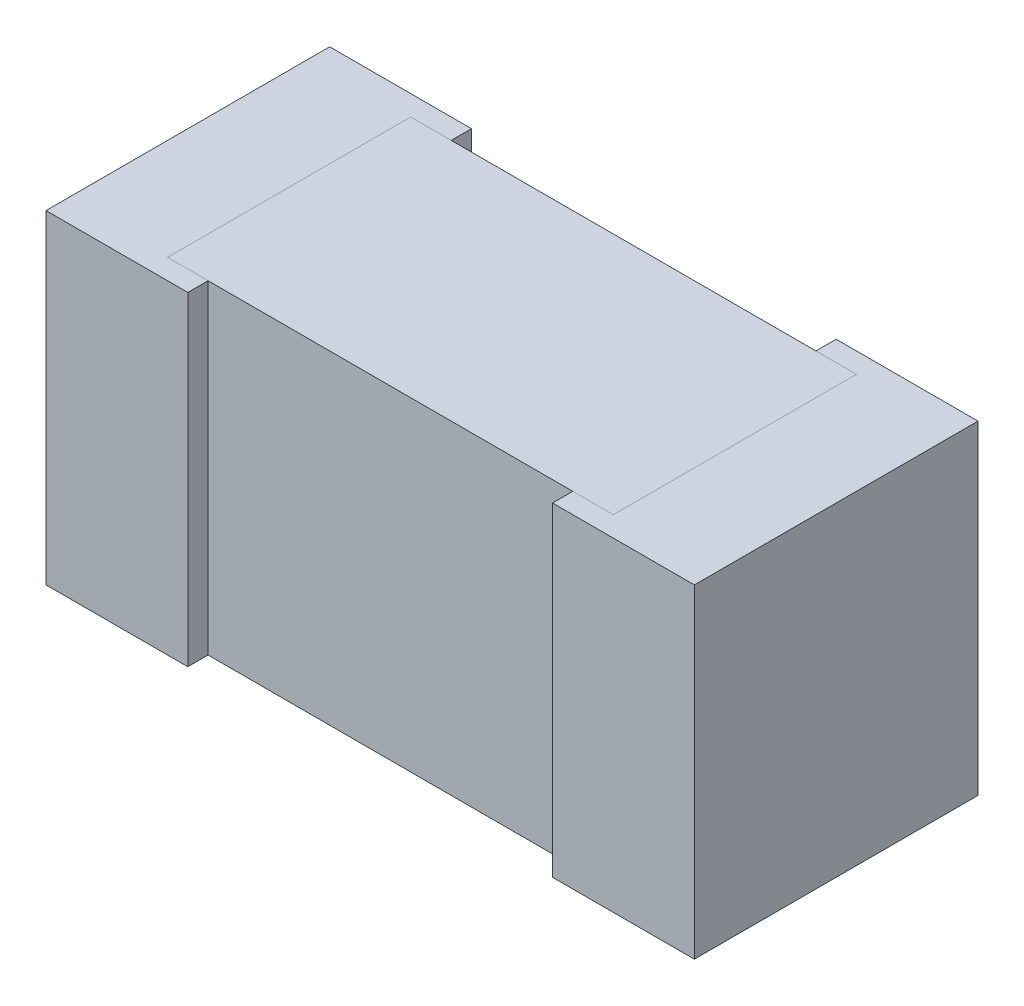
ISO-10303-21;
HEADER;
FILE_DESCRIPTION(('STEP AP214'),'2;1');
FILE_NAME('part.step','',(''),(''),'','','');
FILE_SCHEMA(('AUTOMOTIVE_DESIGN { 1 0 10303 214 1 1 1 1 }'));
ENDSEC;
DATA;
#1=APPLICATION_CONTEXT('core data for automotive mechanical design processes');
#2=APPLICATION_PROTOCOL_DEFINITION('international standard','automotive_design',2000,#1);
#3=PRODUCT_CONTEXT('',#1,'mechanical');
#4=PRODUCT('Part','Part','',(#3));
#5=PRODUCT_RELATED_PRODUCT_CATEGORY('part','',(#4));
#6=PRODUCT_DEFINITION_FORMATION('','',#4);
#7=PRODUCT_DEFINITION_CONTEXT('part definition',#1,'design');
#8=PRODUCT_DEFINITION('design','',#6,#7);
#9=PRODUCT_DEFINITION_SHAPE('','',#8);
#10=(LENGTH_UNIT() NAMED_UNIT(*) SI_UNIT(.MILLI.,.METRE.));
#11=(NAMED_UNIT(*) PLANE_ANGLE_UNIT() SI_UNIT($,.RADIAN.));
#12=(NAMED_UNIT(*) SI_UNIT($,.STERADIAN.) SOLID_ANGLE_UNIT());
#13=UNCERTAINTY_MEASURE_WITH_UNIT(LENGTH_MEASURE(1.E-05),#10,'distance_accuracy_value','');
#14=(GEOMETRIC_REPRESENTATION_CONTEXT(3) GLOBAL_UNCERTAINTY_ASSIGNED_CONTEXT((#13)) GLOBAL_UNIT_ASSIGNED_CONTEXT((#10,
#11,#12)) REPRESENTATION_CONTEXT('',''));
#15=CARTESIAN_POINT('',(0.,0.,0.));
#16=DIRECTION('',(0.,0.,1.));
#17=DIRECTION('',(1.,0.,0.));
#18=AXIS2_PLACEMENT_3D('',#15,#16,#17);
#19=CARTESIAN_POINT('',(-0.45,-0.4,0.65));
#20=DIRECTION('',(0.,0.,-1.));
#21=DIRECTION('',(-1.,0.,0.));
#22=AXIS2_PLACEMENT_3D('',#19,#20,#21);
#23=PLANE('',#22);
#24=DIRECTION('',(0.,1.,0.));
#25=VECTOR('',#24,1.);
#26=CARTESIAN_POINT('',(-0.45,-0.4,0.65));
#27=LINE('',#26,#25);
#28=CARTESIAN_POINT('',(-0.45,-0.4,0.65));
#29=VERTEX_POINT('',#28);
#30=CARTESIAN_POINT('',(-0.45,0.4,0.65));
#31=VERTEX_POINT('',#30);
#32=EDGE_CURVE('P0_E19',#29,#31,#27,.T.);
#33=ORIENTED_EDGE('',*,*,#32,.F.);
#34=DIRECTION('',(1.,0.,0.));
#35=VECTOR('',#34,1.);
#36=CARTESIAN_POINT('',(-0.8,-0.4,0.65));
#37=LINE('',#36,#35);
#38=CARTESIAN_POINT('',(-0.55,-0.4,0.65));
#39=VERTEX_POINT('',#38);
#40=EDGE_CURVE('P0_E135',#39,#29,#37,.T.);
#41=ORIENTED_EDGE('',*,*,#40,.F.);
#42=DIRECTION('',(0.,1.,0.));
#43=VECTOR('',#42,1.);
#44=CARTESIAN_POINT('',(-0.55,-0.4,0.65));
#45=LINE('',#44,#43);
#46=CARTESIAN_POINT('',(-0.55,0.4,0.65));
#47=VERTEX_POINT('',#46);
#48=EDGE_CURVE('P0_E78',#47,#39,#45,.F.);
#49=ORIENTED_EDGE('',*,*,#48,.F.);
#50=DIRECTION('',(1.,0.,0.));
#51=VECTOR('',#50,1.);
#52=CARTESIAN_POINT('',(-0.8,0.4,0.65));
#53=LINE('',#52,#51);
#54=EDGE_CURVE('P0_E105',#31,#47,#53,.F.);
#55=ORIENTED_EDGE('',*,*,#54,.F.);
#56=EDGE_LOOP('',(#33,#41,#49,#55));
#57=FACE_BOUND('',#56,.T.);
#58=ADVANCED_FACE('P0_F16',(#57),#23,.T.);
#59=CARTESIAN_POINT('',(-0.45,-0.4,0.7));
#60=DIRECTION('',(1.,0.,0.));
#61=DIRECTION('',(0.,0.,-1.));
#62=AXIS2_PLACEMENT_3D('',#59,#60,#61);
#63=PLANE('',#62);
#64=DIRECTION('',(0.,1.,0.));
#65=VECTOR('',#64,1.);
#66=CARTESIAN_POINT('',(-0.45,-0.4,0.7));
#67=LINE('',#66,#65);
#68=CARTESIAN_POINT('',(-0.45,-0.4,0.7));
#69=VERTEX_POINT('',#68);
#70=CARTESIAN_POINT('',(-0.45,0.4,0.7));
#71=VERTEX_POINT('',#70);
#72=EDGE_CURVE('P0_E106',#69,#71,#67,.T.);
#73=ORIENTED_EDGE('',*,*,#72,.F.);
#74=DIRECTION('',(0.,0.,-1.));
#75=VECTOR('',#74,1.);
#76=CARTESIAN_POINT('',(-0.45,-0.4,0.));
#77=LINE('',#76,#75);
#78=EDGE_CURVE('P0_E118',#29,#69,#77,.F.);
#79=ORIENTED_EDGE('',*,*,#78,.F.);
#80=ORIENTED_EDGE('',*,*,#32,.T.);
#81=DIRECTION('',(0.,0.,1.));
#82=VECTOR('',#81,1.);
#83=CARTESIAN_POINT('',(-0.45,0.4,0.));
#84=LINE('',#83,#82);
#85=EDGE_CURVE('P0_E115',#71,#31,#84,.F.);
#86=ORIENTED_EDGE('',*,*,#85,.F.);
#87=EDGE_LOOP('',(#73,#79,#80,#86));
#88=FACE_BOUND('',#87,.T.);
#89=ADVANCED_FACE('P0_F114',(#88),#63,.T.);
#90=CARTESIAN_POINT('',(-0.45,-0.4,0.05));
#91=DIRECTION('',(1.,0.,0.));
#92=DIRECTION('',(0.,0.,-1.));
#93=AXIS2_PLACEMENT_3D('',#90,#91,#92);
#94=PLANE('',#93);
#95=DIRECTION('',(0.,1.,0.));
#96=VECTOR('',#95,1.);
#97=CARTESIAN_POINT('',(-0.45,-0.4,0.05));
#98=LINE('',#97,#96);
#99=CARTESIAN_POINT('',(-0.45,-0.4,0.05));
#100=VERTEX_POINT('',#99);
#101=CARTESIAN_POINT('',(-0.45,0.4,0.05));
#102=VERTEX_POINT('',#101);
#103=EDGE_CURVE('P0_E94',#100,#102,#98,.T.);
#104=ORIENTED_EDGE('',*,*,#103,.F.);
#105=DIRECTION('',(0.,0.,-1.));
#106=VECTOR('',#105,1.);
#107=CARTESIAN_POINT('',(-0.45,-0.4,0.));
#108=LINE('',#107,#106);
#109=CARTESIAN_POINT('',(-0.45,-0.4,0.));
#110=VERTEX_POINT('',#109);
#111=EDGE_CURVE('P0_E134',#110,#100,#108,.F.);
#112=ORIENTED_EDGE('',*,*,#111,.F.);
#113=DIRECTION('',(0.,1.,0.));
#114=VECTOR('',#113,1.);
#115=CARTESIAN_POINT('',(-0.45,-0.4,0.));
#116=LINE('',#115,#114);
#117=CARTESIAN_POINT('',(-0.45,0.4,0.));
#118=VERTEX_POINT('',#117);
#119=EDGE_CURVE('P0_E131',#118,#110,#116,.F.);
#120=ORIENTED_EDGE('',*,*,#119,.F.);
#121=DIRECTION('',(0.,0.,1.));
#122=VECTOR('',#121,1.);
#123=CARTESIAN_POINT('',(-0.45,0.4,0.));
#124=LINE('',#123,#122);
#125=EDGE_CURVE('P0_E101',#102,#118,#124,.F.);
#126=ORIENTED_EDGE('',*,*,#125,.F.);
#127=EDGE_LOOP('',(#104,#112,#120,#126));
#128=FACE_BOUND('',#127,.T.);
#129=ADVANCED_FACE('P0_F132',(#128),#94,.T.);
#130=CARTESIAN_POINT('',(-0.55,-0.4,0.05));
#131=DIRECTION('',(0.,0.,1.));
#132=DIRECTION('',(1.,0.,0.));
#133=AXIS2_PLACEMENT_3D('',#130,#131,#132);
#134=PLANE('',#133);
#135=DIRECTION('',(0.,1.,0.));
#136=VECTOR('',#135,1.);
#137=CARTESIAN_POINT('',(-0.55,-0.4,0.05));
#138=LINE('',#137,#136);
#139=CARTESIAN_POINT('',(-0.55,-0.4,0.05));
#140=VERTEX_POINT('',#139);
#141=CARTESIAN_POINT('',(-0.55,0.4,0.05));
#142=VERTEX_POINT('',#141);
#143=EDGE_CURVE('P0_E83',#140,#142,#138,.T.);
#144=ORIENTED_EDGE('',*,*,#143,.F.);
#145=DIRECTION('',(1.,0.,0.));
#146=VECTOR('',#145,1.);
#147=CARTESIAN_POINT('',(-0.8,-0.4,0.05));
#148=LINE('',#147,#146);
#149=EDGE_CURVE('P0_E148',#100,#140,#148,.F.);
#150=ORIENTED_EDGE('',*,*,#149,.F.);
#151=ORIENTED_EDGE('',*,*,#103,.T.);
#152=DIRECTION('',(1.,0.,0.));
#153=VECTOR('',#152,1.);
#154=CARTESIAN_POINT('',(-0.8,0.4,0.05));
#155=LINE('',#154,#153);
#156=EDGE_CURVE('P0_E97',#142,#102,#155,.T.);
#157=ORIENTED_EDGE('',*,*,#156,.F.);
#158=EDGE_LOOP('',(#144,#150,#151,#157));
#159=FACE_BOUND('',#158,.T.);
#160=ADVANCED_FACE('P0_F98',(#159),#134,.T.);
#161=CARTESIAN_POINT('',(-0.55,-0.4,0.65));
#162=DIRECTION('',(1.,0.,0.));
#163=DIRECTION('',(0.,0.,-1.));
#164=AXIS2_PLACEMENT_3D('',#161,#162,#163);
#165=PLANE('',#164);
#166=ORIENTED_EDGE('',*,*,#48,.T.);
#167=DIRECTION('',(0.,0.,-1.));
#168=VECTOR('',#167,1.);
#169=CARTESIAN_POINT('',(-0.55,-0.4,0.));
#170=LINE('',#169,#168);
#171=EDGE_CURVE('P0_E90',#140,#39,#170,.F.);
#172=ORIENTED_EDGE('',*,*,#171,.F.);
#173=ORIENTED_EDGE('',*,*,#143,.T.);
#174=DIRECTION('',(0.,0.,1.));
#175=VECTOR('',#174,1.);
#176=CARTESIAN_POINT('',(-0.55,0.4,0.));
#177=LINE('',#176,#175);
#178=EDGE_CURVE('P0_E87',#47,#142,#177,.F.);
#179=ORIENTED_EDGE('',*,*,#178,.F.);
#180=EDGE_LOOP('',(#166,#172,#173,#179));
#181=FACE_BOUND('',#180,.T.);
#182=ADVANCED_FACE('P0_F85',(#181),#165,.T.);
#183=CARTESIAN_POINT('',(-0.8,-0.4,0.7));
#184=DIRECTION('',(0.,0.,1.));
#185=DIRECTION('',(1.,0.,0.));
#186=AXIS2_PLACEMENT_3D('',#183,#184,#185);
#187=PLANE('',#186);
#188=DIRECTION('',(0.,1.,0.));
#189=VECTOR('',#188,1.);
#190=CARTESIAN_POINT('',(-0.8,-0.4,0.7));
#191=LINE('',#190,#189);
#192=CARTESIAN_POINT('',(-0.8,-0.4,0.7));
#193=VERTEX_POINT('',#192);
#194=CARTESIAN_POINT('',(-0.8,0.4,0.7));
#195=VERTEX_POINT('',#194);
#196=EDGE_CURVE('P0_E151',#193,#195,#191,.T.);
#197=ORIENTED_EDGE('',*,*,#196,.F.);
#198=DIRECTION('',(1.,0.,0.));
#199=VECTOR('',#198,1.);
#200=CARTESIAN_POINT('',(-0.8,-0.4,0.7));
#201=LINE('',#200,#199);
#202=EDGE_CURVE('P0_E143',#69,#193,#201,.F.);
#203=ORIENTED_EDGE('',*,*,#202,.F.);
#204=ORIENTED_EDGE('',*,*,#72,.T.);
#205=DIRECTION('',(1.,0.,0.));
#206=VECTOR('',#205,1.);
#207=CARTESIAN_POINT('',(-0.8,0.4,0.7));
#208=LINE('',#207,#206);
#209=EDGE_CURVE('P0_E123',#195,#71,#208,.T.);
#210=ORIENTED_EDGE('',*,*,#209,.F.);
#211=EDGE_LOOP('',(#197,#203,#204,#210));
#212=FACE_BOUND('',#211,.T.);
#213=ADVANCED_FACE('P0_F160',(#212),#187,.T.);
#214=CARTESIAN_POINT('',(-0.8,0.4,0.));
#215=DIRECTION('',(0.,1.,0.));
#216=DIRECTION('',(0.,0.,1.));
#217=AXIS2_PLACEMENT_3D('',#214,#215,#216);
#218=PLANE('',#217);
#219=ORIENTED_EDGE('',*,*,#85,.T.);
#220=ORIENTED_EDGE('',*,*,#54,.T.);
#221=ORIENTED_EDGE('',*,*,#178,.T.);
#222=ORIENTED_EDGE('',*,*,#156,.T.);
#223=ORIENTED_EDGE('',*,*,#125,.T.);
#224=DIRECTION('',(-1.,0.,0.));
#225=VECTOR('',#224,1.);
#226=CARTESIAN_POINT('',(-0.45,0.4,0.));
#227=LINE('',#226,#225);
#228=CARTESIAN_POINT('',(-0.8,0.4,0.));
#229=VERTEX_POINT('',#228);
#230=EDGE_CURVE('P0_E120',#229,#118,#227,.F.);
#231=ORIENTED_EDGE('',*,*,#230,.F.);
#232=DIRECTION('',(0.,0.,1.));
#233=VECTOR('',#232,1.);
#234=CARTESIAN_POINT('',(-0.8,0.4,0.));
#235=LINE('',#234,#233);
#236=EDGE_CURVE('P0_E154',#195,#229,#235,.F.);
#237=ORIENTED_EDGE('',*,*,#236,.F.);
#238=ORIENTED_EDGE('',*,*,#209,.T.);
#239=EDGE_LOOP('',(#219,#220,#221,#222,#223,#231,#237,#238));
#240=FACE_BOUND('',#239,.T.);
#241=ADVANCED_FACE('P0_F104',(#240),#218,.T.);
#242=CARTESIAN_POINT('',(-0.45,-0.4,0.));
#243=DIRECTION('',(0.,0.,-1.));
#244=DIRECTION('',(-1.,0.,0.));
#245=AXIS2_PLACEMENT_3D('',#242,#243,#244);
#246=PLANE('',#245);
#247=ORIENTED_EDGE('',*,*,#230,.T.);
#248=ORIENTED_EDGE('',*,*,#119,.T.);
#249=DIRECTION('',(1.,0.,0.));
#250=VECTOR('',#249,1.);
#251=CARTESIAN_POINT('',(-0.8,-0.4,0.));
#252=LINE('',#251,#250);
#253=CARTESIAN_POINT('',(-0.8,-0.4,0.));
#254=VERTEX_POINT('',#253);
#255=EDGE_CURVE('P0_E34',#254,#110,#252,.T.);
#256=ORIENTED_EDGE('',*,*,#255,.F.);
#257=DIRECTION('',(0.,1.,0.));
#258=VECTOR('',#257,1.);
#259=CARTESIAN_POINT('',(-0.8,-0.4,0.));
#260=LINE('',#259,#258);
#261=EDGE_CURVE('P0_E25',#229,#254,#260,.F.);
#262=ORIENTED_EDGE('',*,*,#261,.F.);
#263=EDGE_LOOP('',(#247,#248,#256,#262));
#264=FACE_BOUND('',#263,.T.);
#265=ADVANCED_FACE('P0_F137',(#264),#246,.T.);
#266=CARTESIAN_POINT('',(-0.8,-0.4,0.));
#267=DIRECTION('',(0.,-1.,0.));
#268=DIRECTION('',(0.,0.,-1.));
#269=AXIS2_PLACEMENT_3D('',#266,#267,#268);
#270=PLANE('',#269);
#271=ORIENTED_EDGE('',*,*,#149,.T.);
#272=ORIENTED_EDGE('',*,*,#171,.T.);
#273=ORIENTED_EDGE('',*,*,#40,.T.);
#274=ORIENTED_EDGE('',*,*,#78,.T.);
#275=ORIENTED_EDGE('',*,*,#202,.T.);
#276=DIRECTION('',(0.,0.,1.));
#277=VECTOR('',#276,1.);
#278=CARTESIAN_POINT('',(-0.8,-0.4,0.));
#279=LINE('',#278,#277);
#280=EDGE_CURVE('P0_E11',#254,#193,#279,.T.);
#281=ORIENTED_EDGE('',*,*,#280,.F.);
#282=ORIENTED_EDGE('',*,*,#255,.T.);
#283=ORIENTED_EDGE('',*,*,#111,.T.);
#284=EDGE_LOOP('',(#271,#272,#273,#274,#275,#281,#282,#283));
#285=FACE_BOUND('',#284,.T.);
#286=ADVANCED_FACE('P0_F162',(#285),#270,.T.);
#287=CARTESIAN_POINT('',(-0.8,-0.4,0.));
#288=DIRECTION('',(-1.,0.,0.));
#289=DIRECTION('',(0.,0.,1.));
#290=AXIS2_PLACEMENT_3D('',#287,#288,#289);
#291=PLANE('',#290);
#292=ORIENTED_EDGE('',*,*,#261,.T.);
#293=ORIENTED_EDGE('',*,*,#280,.T.);
#294=ORIENTED_EDGE('',*,*,#196,.T.);
#295=ORIENTED_EDGE('',*,*,#236,.T.);
#296=EDGE_LOOP('',(#292,#293,#294,#295));
#297=FACE_BOUND('',#296,.T.);
#298=ADVANCED_FACE('P0_F157',(#297),#291,.T.);
#299=CLOSED_SHELL('',(#58,#89,#129,#160,#182,#213,#241,#265,#286,#298));
#300=MANIFOLD_SOLID_BREP('P0_B1',#299);
#301=CARTESIAN_POINT('',(-0.55,-0.4,0.65));
#302=DIRECTION('',(0.,0.,1.));
#303=DIRECTION('',(1.,0.,0.));
#304=AXIS2_PLACEMENT_3D('',#301,#302,#303);
#305=PLANE('',#304);
#306=DIRECTION('',(1.,0.,0.));
#307=VECTOR('',#306,1.);
#308=CARTESIAN_POINT('',(-0.55,0.4,0.65));
#309=LINE('',#308,#307);
#310=CARTESIAN_POINT('',(-0.55,0.4,0.65));
#311=VERTEX_POINT('',#310);
#312=CARTESIAN_POINT('',(0.55,0.4,0.65));
#313=VERTEX_POINT('',#312);
#314=EDGE_CURVE('P1_E54',#311,#313,#309,.T.);
#315=ORIENTED_EDGE('',*,*,#314,.F.);
#316=DIRECTION('',(0.,1.,0.));
#317=VECTOR('',#316,1.);
#318=CARTESIAN_POINT('',(-0.55,-0.4,0.65));
#319=LINE('',#318,#317);
#320=CARTESIAN_POINT('',(-0.55,-0.4,0.65));
#321=VERTEX_POINT('',#320);
#322=EDGE_CURVE('P1_E19',#321,#311,#319,.T.);
#323=ORIENTED_EDGE('',*,*,#322,.F.);
#324=DIRECTION('',(1.,0.,0.));
#325=VECTOR('',#324,1.);
#326=CARTESIAN_POINT('',(0.55,-0.4,0.65));
#327=LINE('',#326,#325);
#328=CARTESIAN_POINT('',(0.55,-0.4,0.65));
#329=VERTEX_POINT('',#328);
#330=EDGE_CURVE('P1_E79',#329,#321,#327,.F.);
#331=ORIENTED_EDGE('',*,*,#330,.F.);
#332=DIRECTION('',(0.,1.,0.));
#333=VECTOR('',#332,1.);
#334=CARTESIAN_POINT('',(0.55,0.4,0.65));
#335=LINE('',#334,#333);
#336=EDGE_CURVE('P1_E67',#313,#329,#335,.F.);
#337=ORIENTED_EDGE('',*,*,#336,.F.);
#338=EDGE_LOOP('',(#315,#323,#331,#337));
#339=FACE_BOUND('',#338,.T.);
#340=ADVANCED_FACE('P1_F16',(#339),#305,.T.);
#341=CARTESIAN_POINT('',(-0.55,-0.4,0.05));
#342=DIRECTION('',(-1.,0.,0.));
#343=DIRECTION('',(0.,0.,1.));
#344=AXIS2_PLACEMENT_3D('',#341,#342,#343);
#345=PLANE('',#344);
#346=DIRECTION('',(0.,0.,1.));
#347=VECTOR('',#346,1.);
#348=CARTESIAN_POINT('',(-0.55,0.4,0.05));
#349=LINE('',#348,#347);
#350=CARTESIAN_POINT('',(-0.55,0.4,0.05));
#351=VERTEX_POINT('',#350);
#352=EDGE_CURVE('P1_E60',#351,#311,#349,.T.);
#353=ORIENTED_EDGE('',*,*,#352,.F.);
#354=DIRECTION('',(0.,1.,0.));
#355=VECTOR('',#354,1.);
#356=CARTESIAN_POINT('',(-0.55,-0.4,0.05));
#357=LINE('',#356,#355);
#358=CARTESIAN_POINT('',(-0.55,-0.4,0.05));
#359=VERTEX_POINT('',#358);
#360=EDGE_CURVE('P1_E82',#359,#351,#357,.T.);
#361=ORIENTED_EDGE('',*,*,#360,.F.);
#362=DIRECTION('',(0.,0.,-1.));
#363=VECTOR('',#362,1.);
#364=CARTESIAN_POINT('',(-0.55,-0.4,0.05));
#365=LINE('',#364,#363);
#366=EDGE_CURVE('P1_E63',#321,#359,#365,.T.);
#367=ORIENTED_EDGE('',*,*,#366,.F.);
#368=ORIENTED_EDGE('',*,*,#322,.T.);
#369=EDGE_LOOP('',(#353,#361,#367,#368));
#370=FACE_BOUND('',#369,.T.);
#371=ADVANCED_FACE('P1_F59',(#370),#345,.T.);
#372=CARTESIAN_POINT('',(-0.55,0.4,0.05));
#373=DIRECTION('',(0.,1.,0.));
#374=DIRECTION('',(0.,0.,1.));
#375=AXIS2_PLACEMENT_3D('',#372,#373,#374);
#376=PLANE('',#375);
#377=DIRECTION('',(0.,0.,-1.));
#378=VECTOR('',#377,1.);
#379=CARTESIAN_POINT('',(0.55,0.4,0.05));
#380=LINE('',#379,#378);
#381=CARTESIAN_POINT('',(0.55,0.4,0.05));
#382=VERTEX_POINT('',#381);
#383=EDGE_CURVE('P1_E69',#382,#313,#380,.F.);
#384=ORIENTED_EDGE('',*,*,#383,.F.);
#385=DIRECTION('',(-1.,0.,0.));
#386=VECTOR('',#385,1.);
#387=CARTESIAN_POINT('',(-0.55,0.4,0.05));
#388=LINE('',#387,#386);
#389=EDGE_CURVE('P1_E73',#351,#382,#388,.F.);
#390=ORIENTED_EDGE('',*,*,#389,.F.);
#391=ORIENTED_EDGE('',*,*,#352,.T.);
#392=ORIENTED_EDGE('',*,*,#314,.T.);
#393=EDGE_LOOP('',(#384,#390,#391,#392));
#394=FACE_BOUND('',#393,.T.);
#395=ADVANCED_FACE('P1_F71',(#394),#376,.T.);
#396=CARTESIAN_POINT('',(0.55,0.4,0.05));
#397=DIRECTION('',(1.,0.,0.));
#398=DIRECTION('',(0.,0.,-1.));
#399=AXIS2_PLACEMENT_3D('',#396,#397,#398);
#400=PLANE('',#399);
#401=DIRECTION('',(0.,0.,-1.));
#402=VECTOR('',#401,1.);
#403=CARTESIAN_POINT('',(0.55,-0.4,0.05));
#404=LINE('',#403,#402);
#405=CARTESIAN_POINT('',(0.55,-0.4,0.05));
#406=VERTEX_POINT('',#405);
#407=EDGE_CURVE('P1_E34',#406,#329,#404,.F.);
#408=ORIENTED_EDGE('',*,*,#407,.F.);
#409=DIRECTION('',(0.,1.,0.));
#410=VECTOR('',#409,1.);
#411=CARTESIAN_POINT('',(0.55,-0.4,0.05));
#412=LINE('',#411,#410);
#413=EDGE_CURVE('P1_E25',#382,#406,#412,.F.);
#414=ORIENTED_EDGE('',*,*,#413,.F.);
#415=ORIENTED_EDGE('',*,*,#383,.T.);
#416=ORIENTED_EDGE('',*,*,#336,.T.);
#417=EDGE_LOOP('',(#408,#414,#415,#416));
#418=FACE_BOUND('',#417,.T.);
#419=ADVANCED_FACE('P1_F88',(#418),#400,.T.);
#420=CARTESIAN_POINT('',(0.55,-0.4,0.05));
#421=DIRECTION('',(0.,-1.,0.));
#422=DIRECTION('',(0.,0.,-1.));
#423=AXIS2_PLACEMENT_3D('',#420,#421,#422);
#424=PLANE('',#423);
#425=ORIENTED_EDGE('',*,*,#366,.T.);
#426=DIRECTION('',(-1.,0.,0.));
#427=VECTOR('',#426,1.);
#428=CARTESIAN_POINT('',(-0.55,-0.4,0.05));
#429=LINE('',#428,#427);
#430=EDGE_CURVE('P1_E11',#406,#359,#429,.T.);
#431=ORIENTED_EDGE('',*,*,#430,.F.);
#432=ORIENTED_EDGE('',*,*,#407,.T.);
#433=ORIENTED_EDGE('',*,*,#330,.T.);
#434=EDGE_LOOP('',(#425,#431,#432,#433));
#435=FACE_BOUND('',#434,.T.);
#436=ADVANCED_FACE('P1_F90',(#435),#424,.T.);
#437=CARTESIAN_POINT('',(-0.55,-0.4,0.05));
#438=DIRECTION('',(0.,0.,-1.));
#439=DIRECTION('',(-1.,0.,0.));
#440=AXIS2_PLACEMENT_3D('',#437,#438,#439);
#441=PLANE('',#440);
#442=ORIENTED_EDGE('',*,*,#413,.T.);
#443=ORIENTED_EDGE('',*,*,#430,.T.);
#444=ORIENTED_EDGE('',*,*,#360,.T.);
#445=ORIENTED_EDGE('',*,*,#389,.T.);
#446=EDGE_LOOP('',(#442,#443,#444,#445));
#447=FACE_BOUND('',#446,.T.);
#448=ADVANCED_FACE('P1_F87',(#447),#441,.T.);
#449=CLOSED_SHELL('',(#340,#371,#395,#419,#436,#448));
#450=MANIFOLD_SOLID_BREP('P1_B1',#449);
#451=CARTESIAN_POINT('',(0.55,-0.4,0.65));
#452=DIRECTION('',(0.,0.,-1.));
#453=DIRECTION('',(-1.,0.,0.));
#454=AXIS2_PLACEMENT_3D('',#451,#452,#453);
#455=PLANE('',#454);
#456=DIRECTION('',(0.,1.,0.));
#457=VECTOR('',#456,1.);
#458=CARTESIAN_POINT('',(0.55,-0.4,0.65));
#459=LINE('',#458,#457);
#460=CARTESIAN_POINT('',(0.55,-0.4,0.65));
#461=VERTEX_POINT('',#460);
#462=CARTESIAN_POINT('',(0.55,0.4,0.65));
#463=VERTEX_POINT('',#462);
#464=EDGE_CURVE('P2_E78',#461,#463,#459,.T.);
#465=ORIENTED_EDGE('',*,*,#464,.F.);
#466=DIRECTION('',(1.,0.,0.));
#467=VECTOR('',#466,1.);
#468=CARTESIAN_POINT('',(0.45,-0.4,0.65));
#469=LINE('',#468,#467);
#470=CARTESIAN_POINT('',(0.45,-0.4,0.65));
#471=VERTEX_POINT('',#470);
#472=EDGE_CURVE('P2_E106',#471,#461,#469,.T.);
#473=ORIENTED_EDGE('',*,*,#472,.F.);
#474=DIRECTION('',(0.,1.,0.));
#475=VECTOR('',#474,1.);
#476=CARTESIAN_POINT('',(0.45,-0.4,0.65));
#477=LINE('',#476,#475);
#478=CARTESIAN_POINT('',(0.45,0.4,0.65));
#479=VERTEX_POINT('',#478);
#480=EDGE_CURVE('P2_E94',#479,#471,#477,.F.);
#481=ORIENTED_EDGE('',*,*,#480,.F.);
#482=DIRECTION('',(1.,0.,0.));
#483=VECTOR('',#482,1.);
#484=CARTESIAN_POINT('',(0.45,0.4,0.65));
#485=LINE('',#484,#483);
#486=EDGE_CURVE('P2_E112',#463,#479,#485,.F.);
#487=ORIENTED_EDGE('',*,*,#486,.F.);
#488=EDGE_LOOP('',(#465,#473,#481,#487));
#489=FACE_BOUND('',#488,.T.);
#490=ADVANCED_FACE('P2_F16',(#489),#455,.T.);
#491=CARTESIAN_POINT('',(0.45,-0.4,0.));
#492=DIRECTION('',(-1.,0.,0.));
#493=DIRECTION('',(0.,0.,1.));
#494=AXIS2_PLACEMENT_3D('',#491,#492,#493);
#495=PLANE('',#494);
#496=DIRECTION('',(0.,1.,0.));
#497=VECTOR('',#496,1.);
#498=CARTESIAN_POINT('',(0.45,-0.4,0.));
#499=LINE('',#498,#497);
#500=CARTESIAN_POINT('',(0.45,-0.4,0.));
#501=VERTEX_POINT('',#500);
#502=CARTESIAN_POINT('',(0.45,0.4,0.));
#503=VERTEX_POINT('',#502);
#504=EDGE_CURVE('P2_E132',#501,#503,#499,.T.);
#505=ORIENTED_EDGE('',*,*,#504,.F.);
#506=DIRECTION('',(0.,0.,-1.));
#507=VECTOR('',#506,1.);
#508=CARTESIAN_POINT('',(0.45,-0.4,0.));
#509=LINE('',#508,#507);
#510=CARTESIAN_POINT('',(0.45,-0.4,0.05));
#511=VERTEX_POINT('',#510);
#512=EDGE_CURVE('P2_E102',#511,#501,#509,.T.);
#513=ORIENTED_EDGE('',*,*,#512,.F.);
#514=DIRECTION('',(0.,1.,0.));
#515=VECTOR('',#514,1.);
#516=CARTESIAN_POINT('',(0.45,-0.4,0.05));
#517=LINE('',#516,#515);
#518=CARTESIAN_POINT('',(0.45,0.4,0.05));
#519=VERTEX_POINT('',#518);
#520=EDGE_CURVE('P2_E19',#519,#511,#517,.F.);
#521=ORIENTED_EDGE('',*,*,#520,.F.);
#522=DIRECTION('',(0.,0.,1.));
#523=VECTOR('',#522,1.);
#524=CARTESIAN_POINT('',(0.45,0.4,0.));
#525=LINE('',#524,#523);
#526=EDGE_CURVE('P2_E118',#503,#519,#525,.T.);
#527=ORIENTED_EDGE('',*,*,#526,.F.);
#528=EDGE_LOOP('',(#505,#513,#521,#527));
#529=FACE_BOUND('',#528,.T.);
#530=ADVANCED_FACE('P2_F163',(#529),#495,.T.);
#531=CARTESIAN_POINT('',(0.45,-0.4,0.05));
#532=DIRECTION('',(0.,0.,1.));
#533=DIRECTION('',(1.,0.,0.));
#534=AXIS2_PLACEMENT_3D('',#531,#532,#533);
#535=PLANE('',#534);
#536=ORIENTED_EDGE('',*,*,#520,.T.);
#537=DIRECTION('',(1.,0.,0.));
#538=VECTOR('',#537,1.);
#539=CARTESIAN_POINT('',(0.45,-0.4,0.05));
#540=LINE('',#539,#538);
#541=CARTESIAN_POINT('',(0.55,-0.4,0.05));
#542=VERTEX_POINT('',#541);
#543=EDGE_CURVE('P2_E97',#542,#511,#540,.F.);
#544=ORIENTED_EDGE('',*,*,#543,.F.);
#545=DIRECTION('',(0.,1.,0.));
#546=VECTOR('',#545,1.);
#547=CARTESIAN_POINT('',(0.55,-0.4,0.05));
#548=LINE('',#547,#546);
#549=CARTESIAN_POINT('',(0.55,0.4,0.05));
#550=VERTEX_POINT('',#549);
#551=EDGE_CURVE('P2_E83',#550,#542,#548,.F.);
#552=ORIENTED_EDGE('',*,*,#551,.F.);
#553=DIRECTION('',(1.,0.,0.));
#554=VECTOR('',#553,1.);
#555=CARTESIAN_POINT('',(0.45,0.4,0.05));
#556=LINE('',#555,#554);
#557=EDGE_CURVE('P2_E114',#519,#550,#556,.T.);
#558=ORIENTED_EDGE('',*,*,#557,.F.);
#559=EDGE_LOOP('',(#536,#544,#552,#558));
#560=FACE_BOUND('',#559,.T.);
#561=ADVANCED_FACE('P2_F98',(#560),#535,.T.);
#562=CARTESIAN_POINT('',(0.55,-0.4,0.05));
#563=DIRECTION('',(-1.,0.,0.));
#564=DIRECTION('',(0.,0.,1.));
#565=AXIS2_PLACEMENT_3D('',#562,#563,#564);
#566=PLANE('',#565);
#567=ORIENTED_EDGE('',*,*,#551,.T.);
#568=DIRECTION('',(0.,0.,-1.));
#569=VECTOR('',#568,1.);
#570=CARTESIAN_POINT('',(0.55,-0.4,0.));
#571=LINE('',#570,#569);
#572=EDGE_CURVE('P2_E87',#461,#542,#571,.T.);
#573=ORIENTED_EDGE('',*,*,#572,.F.);
#574=ORIENTED_EDGE('',*,*,#464,.T.);
#575=DIRECTION('',(0.,0.,1.));
#576=VECTOR('',#575,1.);
#577=CARTESIAN_POINT('',(0.55,0.4,0.));
#578=LINE('',#577,#576);
#579=EDGE_CURVE('P2_E90',#550,#463,#578,.T.);
#580=ORIENTED_EDGE('',*,*,#579,.F.);
#581=EDGE_LOOP('',(#567,#573,#574,#580));
#582=FACE_BOUND('',#581,.T.);
#583=ADVANCED_FACE('P2_F85',(#582),#566,.T.);
#584=CARTESIAN_POINT('',(0.45,-0.4,0.65));
#585=DIRECTION('',(-1.,0.,0.));
#586=DIRECTION('',(0.,0.,1.));
#587=AXIS2_PLACEMENT_3D('',#584,#585,#586);
#588=PLANE('',#587);
#589=ORIENTED_EDGE('',*,*,#480,.T.);
#590=DIRECTION('',(0.,0.,-1.));
#591=VECTOR('',#590,1.);
#592=CARTESIAN_POINT('',(0.45,-0.4,0.));
#593=LINE('',#592,#591);
#594=CARTESIAN_POINT('',(0.45,-0.4,0.7));
#595=VERTEX_POINT('',#594);
#596=EDGE_CURVE('P2_E135',#595,#471,#593,.T.);
#597=ORIENTED_EDGE('',*,*,#596,.F.);
#598=DIRECTION('',(0.,1.,0.));
#599=VECTOR('',#598,1.);
#600=CARTESIAN_POINT('',(0.45,-0.4,0.7));
#601=LINE('',#600,#599);
#602=CARTESIAN_POINT('',(0.45,0.4,0.7));
#603=VERTEX_POINT('',#602);
#604=EDGE_CURVE('P2_E116',#603,#595,#601,.F.);
#605=ORIENTED_EDGE('',*,*,#604,.F.);
#606=DIRECTION('',(0.,0.,1.));
#607=VECTOR('',#606,1.);
#608=CARTESIAN_POINT('',(0.45,0.4,0.));
#609=LINE('',#608,#607);
#610=EDGE_CURVE('P2_E126',#479,#603,#609,.T.);
#611=ORIENTED_EDGE('',*,*,#610,.F.);
#612=EDGE_LOOP('',(#589,#597,#605,#611));
#613=FACE_BOUND('',#612,.T.);
#614=ADVANCED_FACE('P2_F161',(#613),#588,.T.);
#615=CARTESIAN_POINT('',(0.45,-0.4,0.));
#616=DIRECTION('',(0.,-1.,0.));
#617=DIRECTION('',(0.,0.,-1.));
#618=AXIS2_PLACEMENT_3D('',#615,#616,#617);
#619=PLANE('',#618);
#620=ORIENTED_EDGE('',*,*,#596,.T.);
#621=ORIENTED_EDGE('',*,*,#472,.T.);
#622=ORIENTED_EDGE('',*,*,#572,.T.);
#623=ORIENTED_EDGE('',*,*,#543,.T.);
#624=ORIENTED_EDGE('',*,*,#512,.T.);
#625=DIRECTION('',(-1.,0.,0.));
#626=VECTOR('',#625,1.);
#627=CARTESIAN_POINT('',(0.8,-0.4,0.));
#628=LINE('',#627,#626);
#629=CARTESIAN_POINT('',(0.8,-0.4,0.));
#630=VERTEX_POINT('',#629);
#631=EDGE_CURVE('P2_E129',#630,#501,#628,.T.);
#632=ORIENTED_EDGE('',*,*,#631,.F.);
#633=DIRECTION('',(0.,0.,-1.));
#634=VECTOR('',#633,1.);
#635=CARTESIAN_POINT('',(0.8,-0.4,0.7));
#636=LINE('',#635,#634);
#637=CARTESIAN_POINT('',(0.8,-0.4,0.7));
#638=VERTEX_POINT('',#637);
#639=EDGE_CURVE('P2_E146',#638,#630,#636,.T.);
#640=ORIENTED_EDGE('',*,*,#639,.F.);
#641=DIRECTION('',(1.,0.,0.));
#642=VECTOR('',#641,1.);
#643=CARTESIAN_POINT('',(0.45,-0.4,0.7));
#644=LINE('',#643,#642);
#645=EDGE_CURVE('P2_E151',#595,#638,#644,.T.);
#646=ORIENTED_EDGE('',*,*,#645,.F.);
#647=EDGE_LOOP('',(#620,#621,#622,#623,#624,#632,#640,#646));
#648=FACE_BOUND('',#647,.T.);
#649=ADVANCED_FACE('P2_F105',(#648),#619,.T.);
#650=CARTESIAN_POINT('',(0.8,-0.4,0.));
#651=DIRECTION('',(0.,0.,-1.));
#652=DIRECTION('',(-1.,0.,0.));
#653=AXIS2_PLACEMENT_3D('',#650,#651,#652);
#654=PLANE('',#653);
#655=DIRECTION('',(0.,1.,0.));
#656=VECTOR('',#655,1.);
#657=CARTESIAN_POINT('',(0.8,-0.4,0.));
#658=LINE('',#657,#656);
#659=CARTESIAN_POINT('',(0.8,0.4,0.));
#660=VERTEX_POINT('',#659);
#661=EDGE_CURVE('P2_E142',#630,#660,#658,.T.);
#662=ORIENTED_EDGE('',*,*,#661,.F.);
#663=ORIENTED_EDGE('',*,*,#631,.T.);
#664=ORIENTED_EDGE('',*,*,#504,.T.);
#665=DIRECTION('',(1.,0.,0.));
#666=VECTOR('',#665,1.);
#667=CARTESIAN_POINT('',(0.45,0.4,0.));
#668=LINE('',#667,#666);
#669=EDGE_CURVE('P2_E123',#660,#503,#668,.F.);
#670=ORIENTED_EDGE('',*,*,#669,.F.);
#671=EDGE_LOOP('',(#662,#663,#664,#670));
#672=FACE_BOUND('',#671,.T.);
#673=ADVANCED_FACE('P2_F139',(#672),#654,.T.);
#674=CARTESIAN_POINT('',(0.45,0.4,0.));
#675=DIRECTION('',(0.,1.,0.));
#676=DIRECTION('',(0.,0.,1.));
#677=AXIS2_PLACEMENT_3D('',#674,#675,#676);
#678=PLANE('',#677);
#679=ORIENTED_EDGE('',*,*,#557,.T.);
#680=ORIENTED_EDGE('',*,*,#579,.T.);
#681=ORIENTED_EDGE('',*,*,#486,.T.);
#682=ORIENTED_EDGE('',*,*,#610,.T.);
#683=DIRECTION('',(1.,0.,0.));
#684=VECTOR('',#683,1.);
#685=CARTESIAN_POINT('',(0.45,0.4,0.7));
#686=LINE('',#685,#684);
#687=CARTESIAN_POINT('',(0.8,0.4,0.7));
#688=VERTEX_POINT('',#687);
#689=EDGE_CURVE('P2_E34',#688,#603,#686,.F.);
#690=ORIENTED_EDGE('',*,*,#689,.F.);
#691=DIRECTION('',(0.,0.,-1.));
#692=VECTOR('',#691,1.);
#693=CARTESIAN_POINT('',(0.8,0.4,0.7));
#694=LINE('',#693,#692);
#695=EDGE_CURVE('P2_E25',#660,#688,#694,.F.);
#696=ORIENTED_EDGE('',*,*,#695,.F.);
#697=ORIENTED_EDGE('',*,*,#669,.T.);
#698=ORIENTED_EDGE('',*,*,#526,.T.);
#699=EDGE_LOOP('',(#679,#680,#681,#682,#690,#696,#697,#698));
#700=FACE_BOUND('',#699,.T.);
#701=ADVANCED_FACE('P2_F111',(#700),#678,.T.);
#702=CARTESIAN_POINT('',(0.45,-0.4,0.7));
#703=DIRECTION('',(0.,0.,1.));
#704=DIRECTION('',(1.,0.,0.));
#705=AXIS2_PLACEMENT_3D('',#702,#703,#704);
#706=PLANE('',#705);
#707=ORIENTED_EDGE('',*,*,#604,.T.);
#708=ORIENTED_EDGE('',*,*,#645,.T.);
#709=DIRECTION('',(0.,1.,0.));
#710=VECTOR('',#709,1.);
#711=CARTESIAN_POINT('',(0.8,-0.4,0.7));
#712=LINE('',#711,#710);
#713=EDGE_CURVE('P2_E11',#688,#638,#712,.F.);
#714=ORIENTED_EDGE('',*,*,#713,.F.);
#715=ORIENTED_EDGE('',*,*,#689,.T.);
#716=EDGE_LOOP('',(#707,#708,#714,#715));
#717=FACE_BOUND('',#716,.T.);
#718=ADVANCED_FACE('P2_F158',(#717),#706,.T.);
#719=CARTESIAN_POINT('',(0.8,-0.4,0.7));
#720=DIRECTION('',(1.,0.,0.));
#721=DIRECTION('',(0.,0.,-1.));
#722=AXIS2_PLACEMENT_3D('',#719,#720,#721);
#723=PLANE('',#722);
#724=ORIENTED_EDGE('',*,*,#695,.T.);
#725=ORIENTED_EDGE('',*,*,#713,.T.);
#726=ORIENTED_EDGE('',*,*,#639,.T.);
#727=ORIENTED_EDGE('',*,*,#661,.T.);
#728=EDGE_LOOP('',(#724,#725,#726,#727));
#729=FACE_BOUND('',#728,.T.);
#730=ADVANCED_FACE('P2_F148',(#729),#723,.T.);
#731=CLOSED_SHELL('',(#490,#530,#561,#583,#614,#649,#673,#701,#718,#730));
#732=MANIFOLD_SOLID_BREP('P2_B1',#731);
#733=ADVANCED_BREP_SHAPE_REPRESENTATION('',(#18,#300,#450,#732),#14);
#734=SHAPE_DEFINITION_REPRESENTATION(#9,#733);
ENDSEC;
END-ISO-10303-21;
